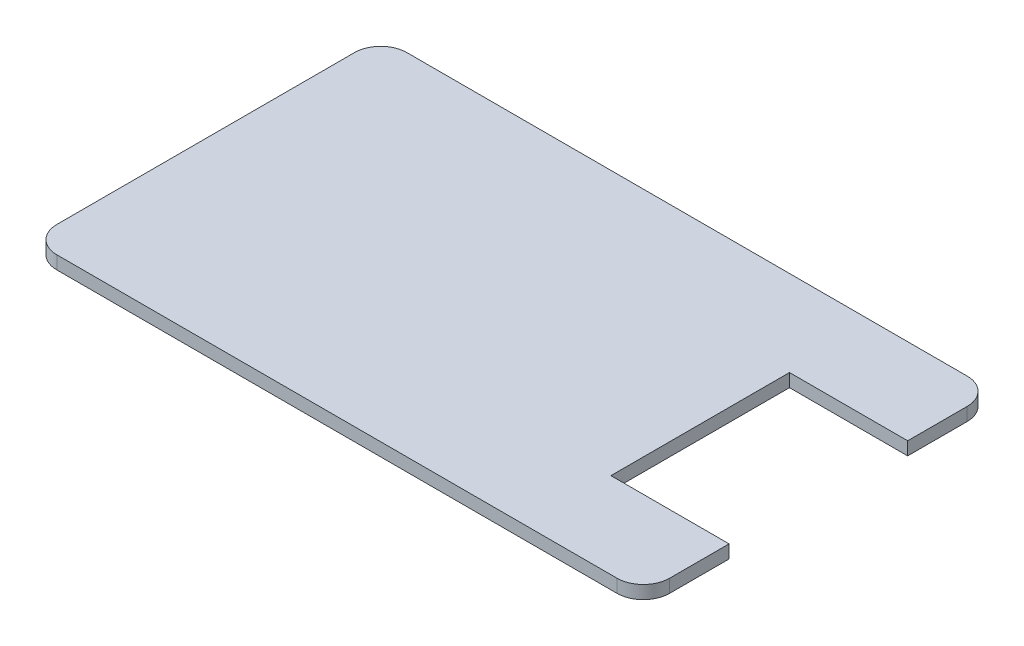
ISO-10303-21;
HEADER;
FILE_DESCRIPTION(('STEP AP214'),'2;1');
FILE_NAME('part.step','',(''),(''),'','','');
FILE_SCHEMA(('AUTOMOTIVE_DESIGN { 1 0 10303 214 1 1 1 1 }'));
ENDSEC;
DATA;
#1=APPLICATION_CONTEXT('core data for automotive mechanical design processes');
#2=APPLICATION_PROTOCOL_DEFINITION('international standard','automotive_design',2000,#1);
#3=PRODUCT_CONTEXT('',#1,'mechanical');
#4=PRODUCT('Part','Part','',(#3));
#5=PRODUCT_RELATED_PRODUCT_CATEGORY('part','',(#4));
#6=PRODUCT_DEFINITION_FORMATION('','',#4);
#7=PRODUCT_DEFINITION_CONTEXT('part definition',#1,'design');
#8=PRODUCT_DEFINITION('design','',#6,#7);
#9=PRODUCT_DEFINITION_SHAPE('','',#8);
#10=(LENGTH_UNIT() NAMED_UNIT(*) SI_UNIT(.MILLI.,.METRE.));
#11=(NAMED_UNIT(*) PLANE_ANGLE_UNIT() SI_UNIT($,.RADIAN.));
#12=(NAMED_UNIT(*) SI_UNIT($,.STERADIAN.) SOLID_ANGLE_UNIT());
#13=UNCERTAINTY_MEASURE_WITH_UNIT(LENGTH_MEASURE(1.E-05),#10,'distance_accuracy_value','');
#14=(GEOMETRIC_REPRESENTATION_CONTEXT(3) GLOBAL_UNCERTAINTY_ASSIGNED_CONTEXT((#13)) GLOBAL_UNIT_ASSIGNED_CONTEXT((#10,
#11,#12)) REPRESENTATION_CONTEXT('',''));
#15=CARTESIAN_POINT('',(0.,0.,0.));
#16=DIRECTION('',(0.,0.,1.));
#17=DIRECTION('',(1.,0.,0.));
#18=AXIS2_PLACEMENT_3D('',#15,#16,#17);
#19=CARTESIAN_POINT('',(35.,1.5,20.));
#20=DIRECTION('',(-1.,0.,0.));
#21=DIRECTION('',(0.,0.,1.));
#22=AXIS2_PLACEMENT_3D('',#19,#20,#21);
#23=PLANE('',#22);
#24=DIRECTION('',(0.,0.,-1.));
#25=VECTOR('',#24,1.);
#26=CARTESIAN_POINT('',(35.,0.,20.));
#27=LINE('',#26,#25);
#28=CARTESIAN_POINT('',(35.,0.,17.));
#29=VERTEX_POINT('',#28);
#30=CARTESIAN_POINT('',(35.,0.,10.2));
#31=VERTEX_POINT('',#30);
#32=EDGE_CURVE('E143',#29,#31,#27,.T.);
#33=ORIENTED_EDGE('',*,*,#32,.T.);
#34=DIRECTION('',(0.,1.,0.));
#35=VECTOR('',#34,1.);
#36=CARTESIAN_POINT('',(35.,0.,10.2));
#37=LINE('',#36,#35);
#38=CARTESIAN_POINT('',(35.,1.5,10.2));
#39=VERTEX_POINT('',#38);
#40=EDGE_CURVE('E210',#31,#39,#37,.T.);
#41=ORIENTED_EDGE('',*,*,#40,.T.);
#42=DIRECTION('',(0.,0.,-1.));
#43=VECTOR('',#42,1.);
#44=CARTESIAN_POINT('',(35.,1.5,20.));
#45=LINE('',#44,#43);
#46=CARTESIAN_POINT('',(35.,1.5,17.));
#47=VERTEX_POINT('',#46);
#48=EDGE_CURVE('E209',#47,#39,#45,.T.);
#49=ORIENTED_EDGE('',*,*,#48,.F.);
#50=DIRECTION('',(0.,-1.,0.));
#51=VECTOR('',#50,1.);
#52=CARTESIAN_POINT('',(35.,1.5,17.));
#53=LINE('',#52,#51);
#54=EDGE_CURVE('E182',#47,#29,#53,.T.);
#55=ORIENTED_EDGE('',*,*,#54,.T.);
#56=EDGE_LOOP('',(#33,#41,#49,#55));
#57=FACE_BOUND('',#56,.T.);
#58=ADVANCED_FACE('F35',(#57),#23,.F.);
#59=CARTESIAN_POINT('',(-35.,1.5,20.));
#60=DIRECTION('',(1.,0.,0.));
#61=DIRECTION('',(0.,0.,-1.));
#62=AXIS2_PLACEMENT_3D('',#59,#60,#61);
#63=PLANE('',#62);
#64=DIRECTION('',(0.,0.,1.));
#65=VECTOR('',#64,1.);
#66=CARTESIAN_POINT('',(-35.,1.5,20.));
#67=LINE('',#66,#65);
#68=CARTESIAN_POINT('',(-35.,1.5,-17.));
#69=VERTEX_POINT('',#68);
#70=CARTESIAN_POINT('',(-35.,1.5,17.));
#71=VERTEX_POINT('',#70);
#72=EDGE_CURVE('E155',#69,#71,#67,.T.);
#73=ORIENTED_EDGE('',*,*,#72,.F.);
#74=DIRECTION('',(0.,-1.,0.));
#75=VECTOR('',#74,1.);
#76=CARTESIAN_POINT('',(-35.,1.5,-17.));
#77=LINE('',#76,#75);
#78=CARTESIAN_POINT('',(-35.,0.,-17.));
#79=VERTEX_POINT('',#78);
#80=EDGE_CURVE('E158',#69,#79,#77,.T.);
#81=ORIENTED_EDGE('',*,*,#80,.T.);
#82=DIRECTION('',(0.,0.,1.));
#83=VECTOR('',#82,1.);
#84=CARTESIAN_POINT('',(-35.,0.,20.));
#85=LINE('',#84,#83);
#86=CARTESIAN_POINT('',(-35.,0.,17.));
#87=VERTEX_POINT('',#86);
#88=EDGE_CURVE('E149',#79,#87,#85,.T.);
#89=ORIENTED_EDGE('',*,*,#88,.T.);
#90=DIRECTION('',(0.,-1.,0.));
#91=VECTOR('',#90,1.);
#92=CARTESIAN_POINT('',(-35.,1.5,17.));
#93=LINE('',#92,#91);
#94=EDGE_CURVE('E156',#87,#71,#93,.F.);
#95=ORIENTED_EDGE('',*,*,#94,.T.);
#96=EDGE_LOOP('',(#73,#81,#89,#95));
#97=FACE_BOUND('',#96,.T.);
#98=ADVANCED_FACE('F228',(#97),#63,.F.);
#99=CARTESIAN_POINT('',(35.,1.5,20.));
#100=DIRECTION('',(0.,0.,-1.));
#101=DIRECTION('',(-1.,0.,0.));
#102=AXIS2_PLACEMENT_3D('',#99,#100,#101);
#103=PLANE('',#102);
#104=DIRECTION('',(1.,0.,0.));
#105=VECTOR('',#104,1.);
#106=CARTESIAN_POINT('',(35.,0.,20.));
#107=LINE('',#106,#105);
#108=CARTESIAN_POINT('',(-32.,0.,20.));
#109=VERTEX_POINT('',#108);
#110=CARTESIAN_POINT('',(32.,0.,20.));
#111=VERTEX_POINT('',#110);
#112=EDGE_CURVE('E144',#109,#111,#107,.T.);
#113=ORIENTED_EDGE('',*,*,#112,.T.);
#114=DIRECTION('',(0.,-1.,0.));
#115=VECTOR('',#114,1.);
#116=CARTESIAN_POINT('',(32.,1.5,20.));
#117=LINE('',#116,#115);
#118=CARTESIAN_POINT('',(32.,1.5,20.));
#119=VERTEX_POINT('',#118);
#120=EDGE_CURVE('E11',#111,#119,#117,.F.);
#121=ORIENTED_EDGE('',*,*,#120,.T.);
#122=DIRECTION('',(1.,0.,0.));
#123=VECTOR('',#122,1.);
#124=CARTESIAN_POINT('',(35.,1.5,20.));
#125=LINE('',#124,#123);
#126=CARTESIAN_POINT('',(-32.,1.5,20.));
#127=VERTEX_POINT('',#126);
#128=EDGE_CURVE('E194',#127,#119,#125,.T.);
#129=ORIENTED_EDGE('',*,*,#128,.F.);
#130=DIRECTION('',(0.,-1.,0.));
#131=VECTOR('',#130,1.);
#132=CARTESIAN_POINT('',(-32.,1.5,20.));
#133=LINE('',#132,#131);
#134=EDGE_CURVE('E43',#127,#109,#133,.T.);
#135=ORIENTED_EDGE('',*,*,#134,.T.);
#136=EDGE_LOOP('',(#113,#121,#129,#135));
#137=FACE_BOUND('',#136,.T.);
#138=ADVANCED_FACE('F191',(#137),#103,.F.);
#139=CARTESIAN_POINT('',(35.,1.5,-10.2));
#140=VERTEX_POINT('',#139);
#141=CARTESIAN_POINT('',(35.,1.5,-17.));
#142=VERTEX_POINT('',#141);
#143=EDGE_CURVE('E58',#140,#142,#45,.T.);
#144=ORIENTED_EDGE('',*,*,#143,.F.);
#145=DIRECTION('',(0.,1.,0.));
#146=VECTOR('',#145,1.);
#147=CARTESIAN_POINT('',(35.,0.,-10.2));
#148=LINE('',#147,#146);
#149=CARTESIAN_POINT('',(35.,0.,-10.2));
#150=VERTEX_POINT('',#149);
#151=EDGE_CURVE('E127',#150,#140,#148,.T.);
#152=ORIENTED_EDGE('',*,*,#151,.F.);
#153=CARTESIAN_POINT('',(35.,0.,-17.));
#154=VERTEX_POINT('',#153);
#155=EDGE_CURVE('E135',#150,#154,#27,.T.);
#156=ORIENTED_EDGE('',*,*,#155,.T.);
#157=DIRECTION('',(0.,-1.,0.));
#158=VECTOR('',#157,1.);
#159=CARTESIAN_POINT('',(35.,1.5,-17.));
#160=LINE('',#159,#158);
#161=EDGE_CURVE('E185',#154,#142,#160,.F.);
#162=ORIENTED_EDGE('',*,*,#161,.T.);
#163=EDGE_LOOP('',(#144,#152,#156,#162));
#164=FACE_BOUND('',#163,.T.);
#165=ADVANCED_FACE('F134',(#164),#23,.F.);
#166=CARTESIAN_POINT('',(35.,1.5,-20.));
#167=DIRECTION('',(0.,0.,1.));
#168=DIRECTION('',(1.,0.,0.));
#169=AXIS2_PLACEMENT_3D('',#166,#167,#168);
#170=PLANE('',#169);
#171=DIRECTION('',(-1.,0.,0.));
#172=VECTOR('',#171,1.);
#173=CARTESIAN_POINT('',(35.,0.,-20.));
#174=LINE('',#173,#172);
#175=CARTESIAN_POINT('',(32.,0.,-20.));
#176=VERTEX_POINT('',#175);
#177=CARTESIAN_POINT('',(-32.,0.,-20.));
#178=VERTEX_POINT('',#177);
#179=EDGE_CURVE('E147',#176,#178,#174,.T.);
#180=ORIENTED_EDGE('',*,*,#179,.T.);
#181=DIRECTION('',(0.,-1.,0.));
#182=VECTOR('',#181,1.);
#183=CARTESIAN_POINT('',(-32.,1.5,-20.));
#184=LINE('',#183,#182);
#185=CARTESIAN_POINT('',(-32.,1.5,-20.));
#186=VERTEX_POINT('',#185);
#187=EDGE_CURVE('E172',#178,#186,#184,.F.);
#188=ORIENTED_EDGE('',*,*,#187,.T.);
#189=DIRECTION('',(-1.,0.,0.));
#190=VECTOR('',#189,1.);
#191=CARTESIAN_POINT('',(35.,1.5,-20.));
#192=LINE('',#191,#190);
#193=CARTESIAN_POINT('',(32.,1.5,-20.));
#194=VERTEX_POINT('',#193);
#195=EDGE_CURVE('E159',#194,#186,#192,.T.);
#196=ORIENTED_EDGE('',*,*,#195,.F.);
#197=DIRECTION('',(0.,-1.,0.));
#198=VECTOR('',#197,1.);
#199=CARTESIAN_POINT('',(32.,1.5,-20.));
#200=LINE('',#199,#198);
#201=EDGE_CURVE('E169',#194,#176,#200,.T.);
#202=ORIENTED_EDGE('',*,*,#201,.T.);
#203=EDGE_LOOP('',(#180,#188,#196,#202));
#204=FACE_BOUND('',#203,.T.);
#205=ADVANCED_FACE('F235',(#204),#170,.F.);
#206=CARTESIAN_POINT('',(0.,1.5,0.));
#207=DIRECTION('',(0.,1.,0.));
#208=DIRECTION('',(0.,0.,1.));
#209=AXIS2_PLACEMENT_3D('',#206,#207,#208);
#210=PLANE('',#209);
#211=DIRECTION('',(1.,0.,0.));
#212=VECTOR('',#211,1.);
#213=CARTESIAN_POINT('',(35.,1.5,10.2));
#214=LINE('',#213,#212);
#215=CARTESIAN_POINT('',(21.5,1.5,10.2));
#216=VERTEX_POINT('',#215);
#217=EDGE_CURVE('E131',#216,#39,#214,.T.);
#218=ORIENTED_EDGE('',*,*,#217,.F.);
#219=DIRECTION('',(0.,0.,1.));
#220=VECTOR('',#219,1.);
#221=CARTESIAN_POINT('',(21.5,1.5,-10.2));
#222=LINE('',#221,#220);
#223=CARTESIAN_POINT('',(21.5,1.5,-10.2));
#224=VERTEX_POINT('',#223);
#225=EDGE_CURVE('E347',#224,#216,#222,.T.);
#226=ORIENTED_EDGE('',*,*,#225,.F.);
#227=DIRECTION('',(-1.,0.,0.));
#228=VECTOR('',#227,1.);
#229=CARTESIAN_POINT('',(35.,1.5,-10.2));
#230=LINE('',#229,#228);
#231=EDGE_CURVE('E349',#140,#224,#230,.T.);
#232=ORIENTED_EDGE('',*,*,#231,.F.);
#233=ORIENTED_EDGE('',*,*,#143,.T.);
#234=CARTESIAN_POINT('',(32.,1.5,-17.));
#235=DIRECTION('',(0.,1.,0.));
#236=DIRECTION('',(0.,0.,1.));
#237=AXIS2_PLACEMENT_3D('',#234,#235,#236);
#238=CIRCLE('',#237,3.);
#239=EDGE_CURVE('E178',#142,#194,#238,.T.);
#240=ORIENTED_EDGE('',*,*,#239,.T.);
#241=ORIENTED_EDGE('',*,*,#195,.T.);
#242=CARTESIAN_POINT('',(-32.,1.5,-17.));
#243=DIRECTION('',(0.,1.,0.));
#244=DIRECTION('',(0.,0.,1.));
#245=AXIS2_PLACEMENT_3D('',#242,#243,#244);
#246=CIRCLE('',#245,3.);
#247=EDGE_CURVE('E180',#186,#69,#246,.T.);
#248=ORIENTED_EDGE('',*,*,#247,.T.);
#249=ORIENTED_EDGE('',*,*,#72,.T.);
#250=CARTESIAN_POINT('',(-32.,1.5,17.));
#251=DIRECTION('',(0.,1.,0.));
#252=DIRECTION('',(0.,0.,1.));
#253=AXIS2_PLACEMENT_3D('',#250,#251,#252);
#254=CIRCLE('',#253,3.);
#255=EDGE_CURVE('E174',#71,#127,#254,.T.);
#256=ORIENTED_EDGE('',*,*,#255,.T.);
#257=ORIENTED_EDGE('',*,*,#128,.T.);
#258=CARTESIAN_POINT('',(32.,1.5,17.));
#259=DIRECTION('',(0.,1.,0.));
#260=DIRECTION('',(0.,0.,1.));
#261=AXIS2_PLACEMENT_3D('',#258,#259,#260);
#262=CIRCLE('',#261,3.);
#263=EDGE_CURVE('E176',#119,#47,#262,.T.);
#264=ORIENTED_EDGE('',*,*,#263,.T.);
#265=ORIENTED_EDGE('',*,*,#48,.T.);
#266=EDGE_LOOP('',(#218,#226,#232,#233,#240,#241,#248,#249,#256,#257,#264,#265));
#267=FACE_BOUND('',#266,.T.);
#268=ADVANCED_FACE('F227',(#267),#210,.T.);
#269=CARTESIAN_POINT('',(0.,0.,0.));
#270=DIRECTION('',(0.,1.,0.));
#271=DIRECTION('',(0.,0.,1.));
#272=AXIS2_PLACEMENT_3D('',#269,#270,#271);
#273=PLANE('',#272);
#274=DIRECTION('',(0.,0.,1.));
#275=VECTOR('',#274,1.);
#276=CARTESIAN_POINT('',(21.5,0.,-10.2));
#277=LINE('',#276,#275);
#278=CARTESIAN_POINT('',(21.5,0.,-10.2));
#279=VERTEX_POINT('',#278);
#280=CARTESIAN_POINT('',(21.5,0.,10.2));
#281=VERTEX_POINT('',#280);
#282=EDGE_CURVE('E50',#279,#281,#277,.T.);
#283=ORIENTED_EDGE('',*,*,#282,.T.);
#284=DIRECTION('',(1.,0.,0.));
#285=VECTOR('',#284,1.);
#286=CARTESIAN_POINT('',(35.,0.,10.2));
#287=LINE('',#286,#285);
#288=EDGE_CURVE('E137',#281,#31,#287,.T.);
#289=ORIENTED_EDGE('',*,*,#288,.T.);
#290=ORIENTED_EDGE('',*,*,#32,.F.);
#291=CARTESIAN_POINT('',(32.,0.,17.));
#292=DIRECTION('',(0.,1.,0.));
#293=DIRECTION('',(0.,0.,1.));
#294=AXIS2_PLACEMENT_3D('',#291,#292,#293);
#295=CIRCLE('',#294,3.);
#296=EDGE_CURVE('E164',#29,#111,#295,.F.);
#297=ORIENTED_EDGE('',*,*,#296,.T.);
#298=ORIENTED_EDGE('',*,*,#112,.F.);
#299=CARTESIAN_POINT('',(-32.,0.,17.));
#300=DIRECTION('',(0.,1.,0.));
#301=DIRECTION('',(0.,0.,1.));
#302=AXIS2_PLACEMENT_3D('',#299,#300,#301);
#303=CIRCLE('',#302,3.);
#304=EDGE_CURVE('E162',#109,#87,#303,.F.);
#305=ORIENTED_EDGE('',*,*,#304,.T.);
#306=ORIENTED_EDGE('',*,*,#88,.F.);
#307=CARTESIAN_POINT('',(-32.,0.,-17.));
#308=DIRECTION('',(0.,1.,0.));
#309=DIRECTION('',(0.,0.,1.));
#310=AXIS2_PLACEMENT_3D('',#307,#308,#309);
#311=CIRCLE('',#310,3.);
#312=EDGE_CURVE('E167',#79,#178,#311,.F.);
#313=ORIENTED_EDGE('',*,*,#312,.T.);
#314=ORIENTED_EDGE('',*,*,#179,.F.);
#315=CARTESIAN_POINT('',(32.,0.,-17.));
#316=DIRECTION('',(0.,1.,0.));
#317=DIRECTION('',(0.,0.,1.));
#318=AXIS2_PLACEMENT_3D('',#315,#316,#317);
#319=CIRCLE('',#318,3.);
#320=EDGE_CURVE('E141',#176,#154,#319,.F.);
#321=ORIENTED_EDGE('',*,*,#320,.T.);
#322=ORIENTED_EDGE('',*,*,#155,.F.);
#323=DIRECTION('',(-1.,0.,0.));
#324=VECTOR('',#323,1.);
#325=CARTESIAN_POINT('',(35.,0.,-10.2));
#326=LINE('',#325,#324);
#327=EDGE_CURVE('E123',#150,#279,#326,.T.);
#328=ORIENTED_EDGE('',*,*,#327,.T.);
#329=EDGE_LOOP('',(#283,#289,#290,#297,#298,#305,#306,#313,#314,#321,#322,#328));
#330=FACE_BOUND('',#329,.T.);
#331=ADVANCED_FACE('F139',(#330),#273,.F.);
#332=CARTESIAN_POINT('',(-32.,1.5,-17.));
#333=DIRECTION('',(0.,-1.,0.));
#334=DIRECTION('',(0.,0.,-1.));
#335=AXIS2_PLACEMENT_3D('',#332,#333,#334);
#336=CYLINDRICAL_SURFACE('',#335,3.);
#337=ORIENTED_EDGE('',*,*,#247,.F.);
#338=ORIENTED_EDGE('',*,*,#187,.F.);
#339=ORIENTED_EDGE('',*,*,#312,.F.);
#340=ORIENTED_EDGE('',*,*,#80,.F.);
#341=EDGE_LOOP('',(#337,#338,#339,#340));
#342=FACE_BOUND('',#341,.T.);
#343=ADVANCED_FACE('F232',(#342),#336,.T.);
#344=CARTESIAN_POINT('',(32.,1.5,-17.));
#345=DIRECTION('',(0.,-1.,0.));
#346=DIRECTION('',(0.,0.,-1.));
#347=AXIS2_PLACEMENT_3D('',#344,#345,#346);
#348=CYLINDRICAL_SURFACE('',#347,3.);
#349=ORIENTED_EDGE('',*,*,#239,.F.);
#350=ORIENTED_EDGE('',*,*,#161,.F.);
#351=ORIENTED_EDGE('',*,*,#320,.F.);
#352=ORIENTED_EDGE('',*,*,#201,.F.);
#353=EDGE_LOOP('',(#349,#350,#351,#352));
#354=FACE_BOUND('',#353,.T.);
#355=ADVANCED_FACE('F240',(#354),#348,.T.);
#356=CARTESIAN_POINT('',(32.,1.5,17.));
#357=DIRECTION('',(0.,-1.,0.));
#358=DIRECTION('',(0.,0.,-1.));
#359=AXIS2_PLACEMENT_3D('',#356,#357,#358);
#360=CYLINDRICAL_SURFACE('',#359,3.);
#361=ORIENTED_EDGE('',*,*,#263,.F.);
#362=ORIENTED_EDGE('',*,*,#120,.F.);
#363=ORIENTED_EDGE('',*,*,#296,.F.);
#364=ORIENTED_EDGE('',*,*,#54,.F.);
#365=EDGE_LOOP('',(#361,#362,#363,#364));
#366=FACE_BOUND('',#365,.T.);
#367=ADVANCED_FACE('F204',(#366),#360,.T.);
#368=CARTESIAN_POINT('',(-32.,1.5,17.));
#369=DIRECTION('',(0.,-1.,0.));
#370=DIRECTION('',(0.,0.,-1.));
#371=AXIS2_PLACEMENT_3D('',#368,#369,#370);
#372=CYLINDRICAL_SURFACE('',#371,3.);
#373=ORIENTED_EDGE('',*,*,#255,.F.);
#374=ORIENTED_EDGE('',*,*,#94,.F.);
#375=ORIENTED_EDGE('',*,*,#304,.F.);
#376=ORIENTED_EDGE('',*,*,#134,.F.);
#377=EDGE_LOOP('',(#373,#374,#375,#376));
#378=FACE_BOUND('',#377,.T.);
#379=ADVANCED_FACE('F37',(#378),#372,.T.);
#380=CARTESIAN_POINT('',(35.,0.,10.2));
#381=DIRECTION('',(0.,0.,1.));
#382=DIRECTION('',(1.,0.,0.));
#383=AXIS2_PLACEMENT_3D('',#380,#381,#382);
#384=PLANE('',#383);
#385=ORIENTED_EDGE('',*,*,#217,.T.);
#386=ORIENTED_EDGE('',*,*,#40,.F.);
#387=ORIENTED_EDGE('',*,*,#288,.F.);
#388=DIRECTION('',(0.,1.,0.));
#389=VECTOR('',#388,1.);
#390=CARTESIAN_POINT('',(21.5,0.,10.2));
#391=LINE('',#390,#389);
#392=EDGE_CURVE('E219',#281,#216,#391,.T.);
#393=ORIENTED_EDGE('',*,*,#392,.T.);
#394=EDGE_LOOP('',(#385,#386,#387,#393));
#395=FACE_BOUND('',#394,.T.);
#396=ADVANCED_FACE('F312',(#395),#384,.F.);
#397=CARTESIAN_POINT('',(21.5,0.,-10.2));
#398=DIRECTION('',(-1.,0.,0.));
#399=DIRECTION('',(0.,0.,1.));
#400=AXIS2_PLACEMENT_3D('',#397,#398,#399);
#401=PLANE('',#400);
#402=ORIENTED_EDGE('',*,*,#225,.T.);
#403=ORIENTED_EDGE('',*,*,#392,.F.);
#404=ORIENTED_EDGE('',*,*,#282,.F.);
#405=DIRECTION('',(0.,1.,0.));
#406=VECTOR('',#405,1.);
#407=CARTESIAN_POINT('',(21.5,0.,-10.2));
#408=LINE('',#407,#406);
#409=EDGE_CURVE('E128',#279,#224,#408,.T.);
#410=ORIENTED_EDGE('',*,*,#409,.T.);
#411=EDGE_LOOP('',(#402,#403,#404,#410));
#412=FACE_BOUND('',#411,.T.);
#413=ADVANCED_FACE('F324',(#412),#401,.F.);
#414=CARTESIAN_POINT('',(35.,0.,-10.2));
#415=DIRECTION('',(0.,0.,-1.));
#416=DIRECTION('',(-1.,0.,0.));
#417=AXIS2_PLACEMENT_3D('',#414,#415,#416);
#418=PLANE('',#417);
#419=ORIENTED_EDGE('',*,*,#231,.T.);
#420=ORIENTED_EDGE('',*,*,#409,.F.);
#421=ORIENTED_EDGE('',*,*,#327,.F.);
#422=ORIENTED_EDGE('',*,*,#151,.T.);
#423=EDGE_LOOP('',(#419,#420,#421,#422));
#424=FACE_BOUND('',#423,.T.);
#425=ADVANCED_FACE('F126',(#424),#418,.F.);
#426=CLOSED_SHELL('',(#58,#98,#138,#165,#205,#268,#331,#343,#355,#367,#379,#396,#413,#425));
#427=MANIFOLD_SOLID_BREP('B2',#426);
#428=ADVANCED_BREP_SHAPE_REPRESENTATION('',(#18,#427),#14);
#429=SHAPE_DEFINITION_REPRESENTATION(#9,#428);
ENDSEC;
END-ISO-10303-21;
